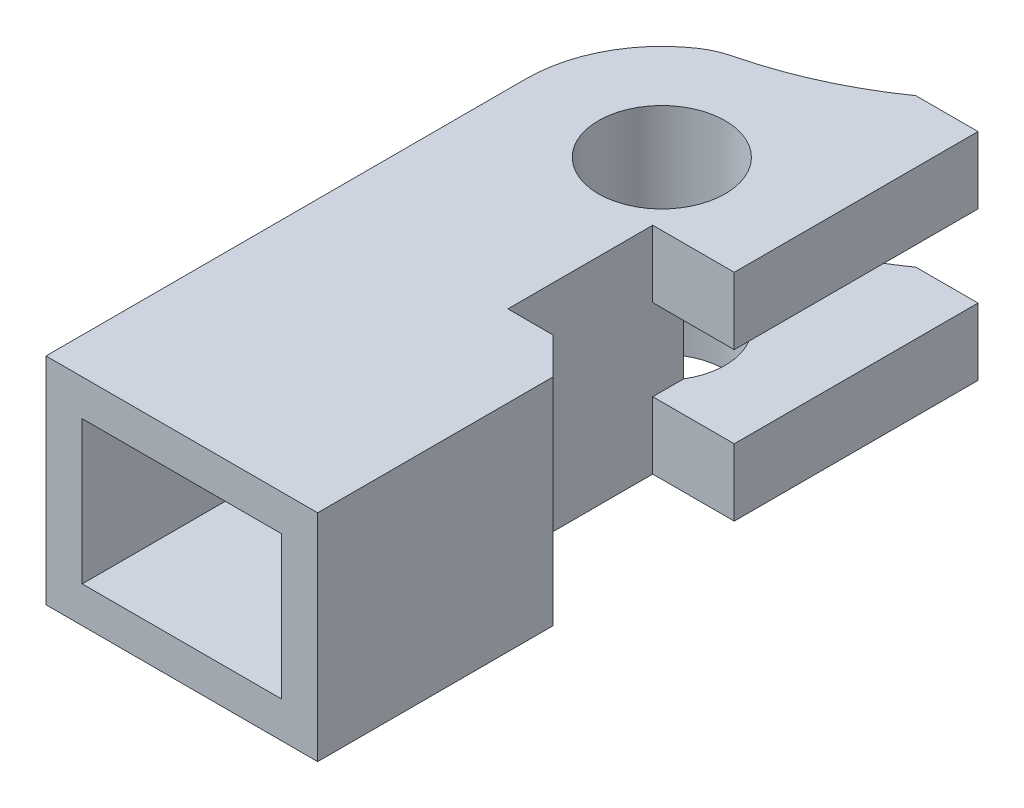
ISO-10303-21;
HEADER;
FILE_DESCRIPTION(('STEP AP214'),'2;1');
FILE_NAME('part.step','',(''),(''),'','','');
FILE_SCHEMA(('AUTOMOTIVE_DESIGN { 1 0 10303 214 1 1 1 1 }'));
ENDSEC;
DATA;
#1=APPLICATION_CONTEXT('core data for automotive mechanical design processes');
#2=APPLICATION_PROTOCOL_DEFINITION('international standard','automotive_design',2000,#1);
#3=PRODUCT_CONTEXT('',#1,'mechanical');
#4=PRODUCT('Part','Part','',(#3));
#5=PRODUCT_RELATED_PRODUCT_CATEGORY('part','',(#4));
#6=PRODUCT_DEFINITION_FORMATION('','',#4);
#7=PRODUCT_DEFINITION_CONTEXT('part definition',#1,'design');
#8=PRODUCT_DEFINITION('design','',#6,#7);
#9=PRODUCT_DEFINITION_SHAPE('','',#8);
#10=(LENGTH_UNIT() NAMED_UNIT(*) SI_UNIT(.MILLI.,.METRE.));
#11=(NAMED_UNIT(*) PLANE_ANGLE_UNIT() SI_UNIT($,.RADIAN.));
#12=(NAMED_UNIT(*) SI_UNIT($,.STERADIAN.) SOLID_ANGLE_UNIT());
#13=UNCERTAINTY_MEASURE_WITH_UNIT(LENGTH_MEASURE(1.E-05),#10,'distance_accuracy_value','');
#14=(GEOMETRIC_REPRESENTATION_CONTEXT(3) GLOBAL_UNCERTAINTY_ASSIGNED_CONTEXT((#13)) GLOBAL_UNIT_ASSIGNED_CONTEXT((#10,
#11,#12)) REPRESENTATION_CONTEXT('',''));
#15=CARTESIAN_POINT('',(0.,0.,0.));
#16=DIRECTION('',(0.,0.,1.));
#17=DIRECTION('',(1.,0.,0.));
#18=AXIS2_PLACEMENT_3D('',#15,#16,#17);
#19=CARTESIAN_POINT('',(-7.49999999999999,0.,-9.95747988102717));
#20=DIRECTION('',(0.,0.,1.));
#21=DIRECTION('',(1.,0.,0.));
#22=AXIS2_PLACEMENT_3D('',#19,#20,#21);
#23=PLANE('',#22);
#24=DIRECTION('',(1.,0.,0.));
#25=VECTOR('',#24,1.);
#26=CARTESIAN_POINT('',(-7.49999999999999,0.,-9.95747988102717));
#27=LINE('',#26,#25);
#28=CARTESIAN_POINT('',(4.06718911135448,0.,-9.95747988102718));
#29=VERTEX_POINT('',#28);
#30=CARTESIAN_POINT('',(7.50000000000013,0.,-9.95747988102717));
#31=VERTEX_POINT('',#30);
#32=EDGE_CURVE('E518',#29,#31,#27,.T.);
#33=ORIENTED_EDGE('',*,*,#32,.F.);
#34=DIRECTION('',(0.,1.,0.));
#35=VECTOR('',#34,1.);
#36=CARTESIAN_POINT('',(4.06718911135448,0.,-9.95747988102717));
#37=LINE('',#36,#35);
#38=CARTESIAN_POINT('',(4.06718911135448,3.7,-9.95747988102717));
#39=VERTEX_POINT('',#38);
#40=EDGE_CURVE('E228',#29,#39,#37,.T.);
#41=ORIENTED_EDGE('',*,*,#40,.T.);
#42=DIRECTION('',(-1.,0.,0.));
#43=VECTOR('',#42,1.);
#44=CARTESIAN_POINT('',(12.0000000000001,3.7,-9.95747988102717));
#45=LINE('',#44,#43);
#46=CARTESIAN_POINT('',(7.50000000000013,3.7,-9.95747988102717));
#47=VERTEX_POINT('',#46);
#48=EDGE_CURVE('E517',#47,#39,#45,.T.);
#49=ORIENTED_EDGE('',*,*,#48,.F.);
#50=DIRECTION('',(0.,1.,0.));
#51=VECTOR('',#50,1.);
#52=CARTESIAN_POINT('',(7.50000000000013,11.9,-9.95747988102717));
#53=LINE('',#52,#51);
#54=EDGE_CURVE('E522',#31,#47,#53,.T.);
#55=ORIENTED_EDGE('',*,*,#54,.F.);
#56=EDGE_LOOP('',(#33,#41,#49,#55));
#57=FACE_BOUND('',#56,.T.);
#58=ADVANCED_FACE('F46',(#57),#23,.F.);
#59=CARTESIAN_POINT('',(7.50000000000013,11.9,3.50088613505739));
#60=DIRECTION('',(0.,0.,-1.));
#61=DIRECTION('',(-1.,0.,0.));
#62=AXIS2_PLACEMENT_3D('',#59,#60,#61);
#63=PLANE('',#62);
#64=DIRECTION('',(0.,-1.,0.));
#65=VECTOR('',#64,1.);
#66=CARTESIAN_POINT('',(7.50000000000013,11.9,3.50088613505739));
#67=LINE('',#66,#65);
#68=CARTESIAN_POINT('',(7.50000000000013,3.7,3.50088613505739));
#69=VERTEX_POINT('',#68);
#70=CARTESIAN_POINT('',(7.50000000000013,0.,3.50088613505739));
#71=VERTEX_POINT('',#70);
#72=EDGE_CURVE('E307',#69,#71,#67,.T.);
#73=ORIENTED_EDGE('',*,*,#72,.F.);
#74=DIRECTION('',(1.,0.,0.));
#75=VECTOR('',#74,1.);
#76=CARTESIAN_POINT('',(12.0000000000001,3.7,3.50088613505739));
#77=LINE('',#76,#75);
#78=CARTESIAN_POINT('',(3.00000000000013,3.7,3.50088613505739));
#79=VERTEX_POINT('',#78);
#80=EDGE_CURVE('E355',#79,#69,#77,.T.);
#81=ORIENTED_EDGE('',*,*,#80,.F.);
#82=DIRECTION('',(0.,-1.,0.));
#83=VECTOR('',#82,1.);
#84=CARTESIAN_POINT('',(3.00000000000013,11.9,3.50088613505739));
#85=LINE('',#84,#83);
#86=CARTESIAN_POINT('',(3.00000000000013,0.,3.50088613505739));
#87=VERTEX_POINT('',#86);
#88=EDGE_CURVE('E306',#79,#87,#85,.T.);
#89=ORIENTED_EDGE('',*,*,#88,.T.);
#90=DIRECTION('',(1.,0.,0.));
#91=VECTOR('',#90,1.);
#92=CARTESIAN_POINT('',(7.50000000000013,0.,3.50088613505739));
#93=LINE('',#92,#91);
#94=EDGE_CURVE('E289',#87,#71,#93,.T.);
#95=ORIENTED_EDGE('',*,*,#94,.T.);
#96=EDGE_LOOP('',(#73,#81,#89,#95));
#97=FACE_BOUND('',#96,.T.);
#98=ADVANCED_FACE('F455',(#97),#63,.F.);
#99=CARTESIAN_POINT('',(7.50000000000013,11.9,1.35308431126191E-13));
#100=DIRECTION('',(-1.,0.,0.));
#101=DIRECTION('',(0.,0.,1.));
#102=AXIS2_PLACEMENT_3D('',#99,#100,#101);
#103=PLANE('',#102);
#104=DIRECTION('',(0.,0.,-1.));
#105=VECTOR('',#104,1.);
#106=CARTESIAN_POINT('',(7.50000000000013,0.,1.35308431126191E-13));
#107=LINE('',#106,#105);
#108=EDGE_CURVE('E297',#71,#31,#107,.T.);
#109=ORIENTED_EDGE('',*,*,#108,.T.);
#110=ORIENTED_EDGE('',*,*,#54,.T.);
#111=DIRECTION('',(0.,0.,1.));
#112=VECTOR('',#111,1.);
#113=CARTESIAN_POINT('',(7.50000000000013,3.7,1.35308431126191E-13));
#114=LINE('',#113,#112);
#115=EDGE_CURVE('E368',#47,#69,#114,.T.);
#116=ORIENTED_EDGE('',*,*,#115,.T.);
#117=ORIENTED_EDGE('',*,*,#72,.T.);
#118=EDGE_LOOP('',(#109,#110,#116,#117));
#119=FACE_BOUND('',#118,.T.);
#120=ADVANCED_FACE('F463',(#119),#103,.F.);
#121=CARTESIAN_POINT('',(4.81608162486087,11.9,-5.65747988102717));
#122=DIRECTION('',(0.,1.,0.));
#123=DIRECTION('',(0.,0.,1.));
#124=AXIS2_PLACEMENT_3D('',#121,#122,#123);
#125=PLANE('',#124);
#126=DIRECTION('',(0.,0.,-1.));
#127=VECTOR('',#126,1.);
#128=CARTESIAN_POINT('',(7.50000000000013,11.9,11.5008861350574));
#129=LINE('',#128,#127);
#130=CARTESIAN_POINT('',(7.50000000000013,11.9,26.5008861350574));
#131=VERTEX_POINT('',#130);
#132=CARTESIAN_POINT('',(7.50000000000013,11.9,13.5008861350574));
#133=VERTEX_POINT('',#132);
#134=EDGE_CURVE('E383',#131,#133,#129,.T.);
#135=ORIENTED_EDGE('',*,*,#134,.T.);
#136=DIRECTION('',(0.707106781186546,0.,0.707106781186549));
#137=VECTOR('',#136,1.);
#138=CARTESIAN_POINT('',(-3.42114219561179,11.9,2.57974393944545));
#139=LINE('',#138,#137);
#140=CARTESIAN_POINT('',(5.50000000000013,11.9,11.5008861350574));
#141=VERTEX_POINT('',#140);
#142=EDGE_CURVE('E11',#133,#141,#139,.F.);
#143=ORIENTED_EDGE('',*,*,#142,.T.);
#144=DIRECTION('',(-1.,0.,0.));
#145=VECTOR('',#144,1.);
#146=CARTESIAN_POINT('',(3.00000000000013,11.9,11.5008861350574));
#147=LINE('',#146,#145);
#148=CARTESIAN_POINT('',(3.00000000000013,11.9,11.5008861350574));
#149=VERTEX_POINT('',#148);
#150=EDGE_CURVE('E275',#141,#149,#147,.T.);
#151=ORIENTED_EDGE('',*,*,#150,.T.);
#152=DIRECTION('',(0.,0.,-1.));
#153=VECTOR('',#152,1.);
#154=CARTESIAN_POINT('',(3.00000000000013,11.9,3.50088613505739));
#155=LINE('',#154,#153);
#156=CARTESIAN_POINT('',(3.00000000000013,11.9,3.50088613505739));
#157=VERTEX_POINT('',#156);
#158=EDGE_CURVE('E388',#149,#157,#155,.T.);
#159=ORIENTED_EDGE('',*,*,#158,.T.);
#160=DIRECTION('',(1.,0.,0.));
#161=VECTOR('',#160,1.);
#162=CARTESIAN_POINT('',(7.50000000000013,11.9,3.50088613505739));
#163=LINE('',#162,#161);
#164=CARTESIAN_POINT('',(7.50000000000013,11.9,3.50088613505739));
#165=VERTEX_POINT('',#164);
#166=EDGE_CURVE('E391',#157,#165,#163,.T.);
#167=ORIENTED_EDGE('',*,*,#166,.T.);
#168=DIRECTION('',(0.,0.,-1.));
#169=VECTOR('',#168,1.);
#170=CARTESIAN_POINT('',(7.50000000000013,11.9,1.35308431126191E-13));
#171=LINE('',#170,#169);
#172=CARTESIAN_POINT('',(7.50000000000013,11.9,-9.95747988102717));
#173=VERTEX_POINT('',#172);
#174=EDGE_CURVE('E394',#165,#173,#171,.T.);
#175=ORIENTED_EDGE('',*,*,#174,.T.);
#176=DIRECTION('',(1.,0.,0.));
#177=VECTOR('',#176,1.);
#178=CARTESIAN_POINT('',(-7.49999999999999,11.9,-9.95747988102717));
#179=LINE('',#178,#177);
#180=CARTESIAN_POINT('',(4.06718911135448,11.9,-9.95747988102717));
#181=VERTEX_POINT('',#180);
#182=EDGE_CURVE('E248',#181,#173,#179,.T.);
#183=ORIENTED_EDGE('',*,*,#182,.F.);
#184=CARTESIAN_POINT('',(-7.86844131425465,11.9,-26.9394678796001));
#185=DIRECTION('',(0.,-1.,0.));
#186=DIRECTION('',(0.,0.,1.));
#187=AXIS2_PLACEMENT_3D('',#184,#185,#186);
#188=CIRCLE('',#187,20.7568588673817);
#189=CARTESIAN_POINT('',(-2.91799523600944,11.9,-6.78158421918604));
#190=VERTEX_POINT('',#189);
#191=EDGE_CURVE('E207',#181,#190,#188,.T.);
#192=ORIENTED_EDGE('',*,*,#191,.T.);
#193=CARTESIAN_POINT('',(-1.96400771605293,11.9,-2.89701116519836));
#194=DIRECTION('',(0.,1.,0.));
#195=DIRECTION('',(0.,0.,1.));
#196=AXIS2_PLACEMENT_3D('',#193,#194,#195);
#197=CIRCLE('',#196,4.);
#198=CARTESIAN_POINT('',(-4.2085879629706,11.9,-6.20788106828229));
#199=VERTEX_POINT('',#198);
#200=EDGE_CURVE('E259',#190,#199,#197,.T.);
#201=ORIENTED_EDGE('',*,*,#200,.T.);
#202=CARTESIAN_POINT('',(0.,11.9,1.35308431126191E-13));
#203=DIRECTION('',(0.,1.,0.));
#204=DIRECTION('',(0.,0.,1.));
#205=AXIS2_PLACEMENT_3D('',#202,#203,#204);
#206=CIRCLE('',#205,7.50000000000006);
#207=CARTESIAN_POINT('',(-7.49999999999999,11.9,1.35308431126191E-13));
#208=VERTEX_POINT('',#207);
#209=EDGE_CURVE('E301',#199,#208,#206,.T.);
#210=ORIENTED_EDGE('',*,*,#209,.T.);
#211=DIRECTION('',(0.,0.,1.));
#212=VECTOR('',#211,1.);
#213=CARTESIAN_POINT('',(-7.49999999999999,11.9,16.5008861350574));
#214=LINE('',#213,#212);
#215=CARTESIAN_POINT('',(-7.49999999999999,11.9,26.5008861350574));
#216=VERTEX_POINT('',#215);
#217=EDGE_CURVE('E380',#208,#216,#214,.T.);
#218=ORIENTED_EDGE('',*,*,#217,.T.);
#219=DIRECTION('',(-1.,0.,0.));
#220=VECTOR('',#219,1.);
#221=CARTESIAN_POINT('',(7.50000000000013,11.9,26.5008861350574));
#222=LINE('',#221,#220);
#223=EDGE_CURVE('E420',#131,#216,#222,.T.);
#224=ORIENTED_EDGE('',*,*,#223,.F.);
#225=EDGE_LOOP('',(#135,#143,#151,#159,#167,#175,#183,#192,#201,#210,#218,#224));
#226=FACE_BOUND('',#225,.T.);
#227=CARTESIAN_POINT('',(0.,11.9,1.35308431126191E-13));
#228=DIRECTION('',(0.,1.,0.));
#229=DIRECTION('',(0.,0.,1.));
#230=AXIS2_PLACEMENT_3D('',#227,#228,#229);
#231=CIRCLE('',#230,3.50000000000018);
#232=CARTESIAN_POINT('',(0.,11.9,3.50000000000032));
#233=VERTEX_POINT('',#232);
#234=EDGE_CURVE('E244',#233,#233,#231,.T.);
#235=ORIENTED_EDGE('',*,*,#234,.F.);
#236=EDGE_LOOP('',(#235));
#237=FACE_BOUND('',#236,.T.);
#238=ADVANCED_FACE('F434',(#226,#237),#125,.T.);
#239=CARTESIAN_POINT('',(4.81608162486087,0.,-5.65747988102717));
#240=DIRECTION('',(0.,1.,0.));
#241=DIRECTION('',(0.,0.,1.));
#242=AXIS2_PLACEMENT_3D('',#239,#240,#241);
#243=PLANE('',#242);
#244=DIRECTION('',(-1.,0.,0.));
#245=VECTOR('',#244,1.);
#246=CARTESIAN_POINT('',(3.00000000000013,0.,11.5008861350574));
#247=LINE('',#246,#245);
#248=CARTESIAN_POINT('',(5.50000000000013,0.,11.5008861350574));
#249=VERTEX_POINT('',#248);
#250=CARTESIAN_POINT('',(3.00000000000013,0.,11.5008861350574));
#251=VERTEX_POINT('',#250);
#252=EDGE_CURVE('E273',#249,#251,#247,.T.);
#253=ORIENTED_EDGE('',*,*,#252,.F.);
#254=DIRECTION('',(-0.707106781186546,0.,-0.707106781186549));
#255=VECTOR('',#254,1.);
#256=CARTESIAN_POINT('',(5.50000000000013,0.,11.5008861350574));
#257=LINE('',#256,#255);
#258=CARTESIAN_POINT('',(7.50000000000013,0.,13.5008861350574));
#259=VERTEX_POINT('',#258);
#260=EDGE_CURVE('E70',#249,#259,#257,.F.);
#261=ORIENTED_EDGE('',*,*,#260,.T.);
#262=DIRECTION('',(0.,0.,-1.));
#263=VECTOR('',#262,1.);
#264=CARTESIAN_POINT('',(7.50000000000013,0.,11.5008861350574));
#265=LINE('',#264,#263);
#266=CARTESIAN_POINT('',(7.50000000000013,0.,26.5008861350574));
#267=VERTEX_POINT('',#266);
#268=EDGE_CURVE('E285',#267,#259,#265,.T.);
#269=ORIENTED_EDGE('',*,*,#268,.F.);
#270=DIRECTION('',(1.,0.,0.));
#271=VECTOR('',#270,1.);
#272=CARTESIAN_POINT('',(-7.49999999999999,0.,26.5008861350574));
#273=LINE('',#272,#271);
#274=CARTESIAN_POINT('',(-7.49999999999999,0.,26.5008861350574));
#275=VERTEX_POINT('',#274);
#276=EDGE_CURVE('E409',#275,#267,#273,.T.);
#277=ORIENTED_EDGE('',*,*,#276,.F.);
#278=DIRECTION('',(0.,0.,1.));
#279=VECTOR('',#278,1.);
#280=CARTESIAN_POINT('',(-7.49999999999999,0.,16.5008861350574));
#281=LINE('',#280,#279);
#282=CARTESIAN_POINT('',(-7.49999999999999,0.,1.35308431126191E-13));
#283=VERTEX_POINT('',#282);
#284=EDGE_CURVE('E243',#283,#275,#281,.T.);
#285=ORIENTED_EDGE('',*,*,#284,.F.);
#286=CARTESIAN_POINT('',(0.,0.,1.35308431126191E-13));
#287=DIRECTION('',(0.,1.,0.));
#288=DIRECTION('',(0.,0.,1.));
#289=AXIS2_PLACEMENT_3D('',#286,#287,#288);
#290=CIRCLE('',#289,7.50000000000006);
#291=CARTESIAN_POINT('',(-4.2085879629706,0.,-6.20788106828229));
#292=VERTEX_POINT('',#291);
#293=EDGE_CURVE('E240',#292,#283,#290,.T.);
#294=ORIENTED_EDGE('',*,*,#293,.F.);
#295=CARTESIAN_POINT('',(-1.96400771605293,0.,-2.89701116519836));
#296=DIRECTION('',(0.,1.,0.));
#297=DIRECTION('',(0.,0.,1.));
#298=AXIS2_PLACEMENT_3D('',#295,#296,#297);
#299=CIRCLE('',#298,4.);
#300=CARTESIAN_POINT('',(-2.91799523600944,0.,-6.78158421918604));
#301=VERTEX_POINT('',#300);
#302=EDGE_CURVE('E253',#292,#301,#299,.F.);
#303=ORIENTED_EDGE('',*,*,#302,.T.);
#304=CARTESIAN_POINT('',(-7.86844131425465,0.,-26.9394678796001));
#305=DIRECTION('',(0.,-1.,0.));
#306=DIRECTION('',(0.,0.,-1.));
#307=AXIS2_PLACEMENT_3D('',#304,#305,#306);
#308=CIRCLE('',#307,20.7568588673817);
#309=EDGE_CURVE('E245',#29,#301,#308,.T.);
#310=ORIENTED_EDGE('',*,*,#309,.F.);
#311=ORIENTED_EDGE('',*,*,#32,.T.);
#312=ORIENTED_EDGE('',*,*,#108,.F.);
#313=ORIENTED_EDGE('',*,*,#94,.F.);
#314=DIRECTION('',(0.,0.,-1.));
#315=VECTOR('',#314,1.);
#316=CARTESIAN_POINT('',(3.00000000000013,0.,3.50088613505739));
#317=LINE('',#316,#315);
#318=EDGE_CURVE('E283',#251,#87,#317,.T.);
#319=ORIENTED_EDGE('',*,*,#318,.F.);
#320=EDGE_LOOP('',(#253,#261,#269,#277,#285,#294,#303,#310,#311,#312,#313,#319));
#321=FACE_BOUND('',#320,.T.);
#322=CARTESIAN_POINT('',(0.,0.,1.35308431126191E-13));
#323=DIRECTION('',(0.,1.,0.));
#324=DIRECTION('',(0.,0.,1.));
#325=AXIS2_PLACEMENT_3D('',#322,#323,#324);
#326=CIRCLE('',#325,3.50000000000018);
#327=CARTESIAN_POINT('',(0.,0.,3.50000000000032));
#328=VERTEX_POINT('',#327);
#329=EDGE_CURVE('E371',#328,#328,#326,.T.);
#330=ORIENTED_EDGE('',*,*,#329,.T.);
#331=EDGE_LOOP('',(#330));
#332=FACE_BOUND('',#331,.T.);
#333=ADVANCED_FACE('F279',(#321,#332),#243,.F.);
#334=CARTESIAN_POINT('',(0.,11.9,1.35308431126191E-13));
#335=DIRECTION('',(0.,-1.,0.));
#336=DIRECTION('',(0.,0.,-1.));
#337=AXIS2_PLACEMENT_3D('',#334,#335,#336);
#338=CYLINDRICAL_SURFACE('',#337,7.50000000000006);
#339=ORIENTED_EDGE('',*,*,#209,.F.);
#340=DIRECTION('',(0.,-1.,0.));
#341=VECTOR('',#340,1.);
#342=CARTESIAN_POINT('',(-4.2085879629706,11.9,-6.20788106828229));
#343=LINE('',#342,#341);
#344=EDGE_CURVE('E234',#199,#292,#343,.T.);
#345=ORIENTED_EDGE('',*,*,#344,.T.);
#346=ORIENTED_EDGE('',*,*,#293,.T.);
#347=DIRECTION('',(0.,-1.,0.));
#348=VECTOR('',#347,1.);
#349=CARTESIAN_POINT('',(-7.49999999999999,11.9,1.35308431126191E-13));
#350=LINE('',#349,#348);
#351=EDGE_CURVE('E315',#208,#283,#350,.T.);
#352=ORIENTED_EDGE('',*,*,#351,.F.);
#353=EDGE_LOOP('',(#339,#345,#346,#352));
#354=FACE_BOUND('',#353,.T.);
#355=ADVANCED_FACE('F440',(#354),#338,.T.);
#356=CARTESIAN_POINT('',(-7.49999999999999,11.9,16.5008861350574));
#357=DIRECTION('',(1.,0.,0.));
#358=DIRECTION('',(0.,0.,-1.));
#359=AXIS2_PLACEMENT_3D('',#356,#357,#358);
#360=PLANE('',#359);
#361=ORIENTED_EDGE('',*,*,#284,.T.);
#362=DIRECTION('',(0.,-1.,0.));
#363=VECTOR('',#362,1.);
#364=CARTESIAN_POINT('',(-7.49999999999999,11.9,26.5008861350574));
#365=LINE('',#364,#363);
#366=EDGE_CURVE('E405',#216,#275,#365,.T.);
#367=ORIENTED_EDGE('',*,*,#366,.F.);
#368=ORIENTED_EDGE('',*,*,#217,.F.);
#369=ORIENTED_EDGE('',*,*,#351,.T.);
#370=EDGE_LOOP('',(#361,#367,#368,#369));
#371=FACE_BOUND('',#370,.T.);
#372=ADVANCED_FACE('F402',(#371),#360,.F.);
#373=CARTESIAN_POINT('',(7.50000000000013,11.9,11.5008861350574));
#374=DIRECTION('',(-1.,0.,0.));
#375=DIRECTION('',(0.,0.,1.));
#376=AXIS2_PLACEMENT_3D('',#373,#374,#375);
#377=PLANE('',#376);
#378=ORIENTED_EDGE('',*,*,#268,.T.);
#379=DIRECTION('',(0.,1.,0.));
#380=VECTOR('',#379,1.);
#381=CARTESIAN_POINT('',(7.50000000000013,11.9,13.5008861350574));
#382=LINE('',#381,#380);
#383=EDGE_CURVE('E56',#259,#133,#382,.T.);
#384=ORIENTED_EDGE('',*,*,#383,.T.);
#385=ORIENTED_EDGE('',*,*,#134,.F.);
#386=DIRECTION('',(0.,1.,0.));
#387=VECTOR('',#386,1.);
#388=CARTESIAN_POINT('',(7.50000000000013,0.,26.5008861350574));
#389=LINE('',#388,#387);
#390=EDGE_CURVE('E414',#267,#131,#389,.T.);
#391=ORIENTED_EDGE('',*,*,#390,.F.);
#392=EDGE_LOOP('',(#378,#384,#385,#391));
#393=FACE_BOUND('',#392,.T.);
#394=ADVANCED_FACE('F487',(#393),#377,.F.);
#395=CARTESIAN_POINT('',(3.00000000000013,11.9,11.5008861350574));
#396=DIRECTION('',(0.,0.,1.));
#397=DIRECTION('',(1.,0.,0.));
#398=AXIS2_PLACEMENT_3D('',#395,#396,#397);
#399=PLANE('',#398);
#400=ORIENTED_EDGE('',*,*,#150,.F.);
#401=DIRECTION('',(0.,-1.,0.));
#402=VECTOR('',#401,1.);
#403=CARTESIAN_POINT('',(5.50000000000013,11.9,11.5008861350574));
#404=LINE('',#403,#402);
#405=EDGE_CURVE('E262',#141,#249,#404,.T.);
#406=ORIENTED_EDGE('',*,*,#405,.T.);
#407=ORIENTED_EDGE('',*,*,#252,.T.);
#408=DIRECTION('',(0.,-1.,0.));
#409=VECTOR('',#408,1.);
#410=CARTESIAN_POINT('',(3.00000000000013,11.9,11.5008861350574));
#411=LINE('',#410,#409);
#412=EDGE_CURVE('E312',#149,#251,#411,.T.);
#413=ORIENTED_EDGE('',*,*,#412,.F.);
#414=EDGE_LOOP('',(#400,#406,#407,#413));
#415=FACE_BOUND('',#414,.T.);
#416=ADVANCED_FACE('F271',(#415),#399,.F.);
#417=CARTESIAN_POINT('',(3.00000000000013,11.9,3.50088613505739));
#418=DIRECTION('',(-1.,0.,0.));
#419=DIRECTION('',(0.,0.,1.));
#420=AXIS2_PLACEMENT_3D('',#417,#418,#419);
#421=PLANE('',#420);
#422=ORIENTED_EDGE('',*,*,#318,.T.);
#423=ORIENTED_EDGE('',*,*,#88,.F.);
#424=DIRECTION('',(0.,0.,-1.));
#425=VECTOR('',#424,1.);
#426=CARTESIAN_POINT('',(3.00000000000013,3.7,13.5631920338064));
#427=LINE('',#426,#425);
#428=CARTESIAN_POINT('',(3.00000000000013,3.7,1.80277563773238));
#429=VERTEX_POINT('',#428);
#430=EDGE_CURVE('E341',#79,#429,#427,.T.);
#431=ORIENTED_EDGE('',*,*,#430,.T.);
#432=DIRECTION('',(0.,-1.,0.));
#433=VECTOR('',#432,1.);
#434=CARTESIAN_POINT('',(3.00000000000013,11.9,1.80277563773238));
#435=LINE('',#434,#433);
#436=CARTESIAN_POINT('',(3.00000000000013,8.2,1.80277563773238));
#437=VERTEX_POINT('',#436);
#438=EDGE_CURVE('E322',#429,#437,#435,.F.);
#439=ORIENTED_EDGE('',*,*,#438,.T.);
#440=DIRECTION('',(0.,0.,-1.));
#441=VECTOR('',#440,1.);
#442=CARTESIAN_POINT('',(3.00000000000013,8.2,13.5631920338064));
#443=LINE('',#442,#441);
#444=CARTESIAN_POINT('',(3.00000000000013,8.2,3.50088613505739));
#445=VERTEX_POINT('',#444);
#446=EDGE_CURVE('E342',#445,#437,#443,.T.);
#447=ORIENTED_EDGE('',*,*,#446,.F.);
#448=EDGE_CURVE('E308',#157,#445,#85,.T.);
#449=ORIENTED_EDGE('',*,*,#448,.F.);
#450=ORIENTED_EDGE('',*,*,#158,.F.);
#451=ORIENTED_EDGE('',*,*,#412,.T.);
#452=EDGE_LOOP('',(#422,#423,#431,#439,#447,#449,#450,#451));
#453=FACE_BOUND('',#452,.T.);
#454=ADVANCED_FACE('F349',(#453),#421,.F.);
#455=ORIENTED_EDGE('',*,*,#448,.T.);
#456=DIRECTION('',(-1.,0.,0.));
#457=VECTOR('',#456,1.);
#458=CARTESIAN_POINT('',(12.0000000000001,8.2,3.50088613505739));
#459=LINE('',#458,#457);
#460=CARTESIAN_POINT('',(7.50000000000013,8.2,3.50088613505739));
#461=VERTEX_POINT('',#460);
#462=EDGE_CURVE('E357',#461,#445,#459,.T.);
#463=ORIENTED_EDGE('',*,*,#462,.F.);
#464=EDGE_CURVE('E302',#165,#461,#67,.T.);
#465=ORIENTED_EDGE('',*,*,#464,.F.);
#466=ORIENTED_EDGE('',*,*,#166,.F.);
#467=EDGE_LOOP('',(#455,#463,#465,#466));
#468=FACE_BOUND('',#467,.T.);
#469=ADVANCED_FACE('F466',(#468),#63,.F.);
#470=DIRECTION('',(0.,0.,-1.));
#471=VECTOR('',#470,1.);
#472=CARTESIAN_POINT('',(7.50000000000013,8.2,1.35308431126191E-13));
#473=LINE('',#472,#471);
#474=CARTESIAN_POINT('',(7.50000000000013,8.2,-9.95747988102717));
#475=VERTEX_POINT('',#474);
#476=EDGE_CURVE('E365',#461,#475,#473,.T.);
#477=ORIENTED_EDGE('',*,*,#476,.T.);
#478=DIRECTION('',(0.,1.,0.));
#479=VECTOR('',#478,1.);
#480=CARTESIAN_POINT('',(7.50000000000013,11.9,-9.95747988102717));
#481=LINE('',#480,#479);
#482=EDGE_CURVE('E225',#475,#173,#481,.T.);
#483=ORIENTED_EDGE('',*,*,#482,.T.);
#484=ORIENTED_EDGE('',*,*,#174,.F.);
#485=ORIENTED_EDGE('',*,*,#464,.T.);
#486=EDGE_LOOP('',(#477,#483,#484,#485));
#487=FACE_BOUND('',#486,.T.);
#488=ADVANCED_FACE('F500',(#487),#103,.F.);
#489=CARTESIAN_POINT('',(0.,11.9,1.35308431126191E-13));
#490=DIRECTION('',(0.,-1.,0.));
#491=DIRECTION('',(0.,0.,-1.));
#492=AXIS2_PLACEMENT_3D('',#489,#490,#491);
#493=CYLINDRICAL_SURFACE('',#492,3.50000000000018);
#494=CARTESIAN_POINT('',(0.,3.7,1.35308431126191E-13));
#495=DIRECTION('',(0.,-1.,0.));
#496=DIRECTION('',(0.,0.,-1.));
#497=AXIS2_PLACEMENT_3D('',#494,#495,#496);
#498=CIRCLE('',#497,3.50000000000018);
#499=CARTESIAN_POINT('',(3.00000000000013,3.7,-1.80277563773211));
#500=VERTEX_POINT('',#499);
#501=EDGE_CURVE('E229',#500,#429,#498,.T.);
#502=ORIENTED_EDGE('',*,*,#501,.F.);
#503=DIRECTION('',(0.,-1.,0.));
#504=VECTOR('',#503,1.);
#505=CARTESIAN_POINT('',(3.00000000000013,11.9,-1.80277563773211));
#506=LINE('',#505,#504);
#507=CARTESIAN_POINT('',(3.00000000000013,8.2,-1.80277563773211));
#508=VERTEX_POINT('',#507);
#509=EDGE_CURVE('E236',#508,#500,#506,.T.);
#510=ORIENTED_EDGE('',*,*,#509,.F.);
#511=CARTESIAN_POINT('',(0.,8.2,1.35308431126191E-13));
#512=DIRECTION('',(0.,1.,0.));
#513=DIRECTION('',(0.,0.,1.));
#514=AXIS2_PLACEMENT_3D('',#511,#512,#513);
#515=CIRCLE('',#514,3.50000000000018);
#516=EDGE_CURVE('E319',#437,#508,#515,.T.);
#517=ORIENTED_EDGE('',*,*,#516,.F.);
#518=ORIENTED_EDGE('',*,*,#438,.F.);
#519=EDGE_LOOP('',(#502,#510,#517,#518));
#520=FACE_BOUND('',#519,.T.);
#521=ORIENTED_EDGE('',*,*,#234,.T.);
#522=EDGE_LOOP('',(#521));
#523=FACE_BOUND('',#522,.T.);
#524=ORIENTED_EDGE('',*,*,#329,.F.);
#525=EDGE_LOOP('',(#524));
#526=FACE_BOUND('',#525,.T.);
#527=ADVANCED_FACE('F345',(#520,#523,#526),#493,.F.);
#528=CARTESIAN_POINT('',(3.00000000000013,3.7,13.5631920338064));
#529=DIRECTION('',(-1.,0.,0.));
#530=DIRECTION('',(0.,0.,1.));
#531=AXIS2_PLACEMENT_3D('',#528,#529,#530);
#532=PLANE('',#531);
#533=CARTESIAN_POINT('',(3.00000000000013,3.7,-9.25545890428567));
#534=VERTEX_POINT('',#533);
#535=EDGE_CURVE('E331',#500,#534,#427,.T.);
#536=ORIENTED_EDGE('',*,*,#535,.T.);
#537=DIRECTION('',(0.,-1.,0.));
#538=VECTOR('',#537,1.);
#539=CARTESIAN_POINT('',(3.00000000000013,11.9,-9.25545890428567));
#540=LINE('',#539,#538);
#541=CARTESIAN_POINT('',(3.00000000000013,8.2,-9.25545890428567));
#542=VERTEX_POINT('',#541);
#543=EDGE_CURVE('E221',#534,#542,#540,.F.);
#544=ORIENTED_EDGE('',*,*,#543,.T.);
#545=EDGE_CURVE('E219',#508,#542,#443,.T.);
#546=ORIENTED_EDGE('',*,*,#545,.F.);
#547=ORIENTED_EDGE('',*,*,#509,.T.);
#548=EDGE_LOOP('',(#536,#544,#546,#547));
#549=FACE_BOUND('',#548,.T.);
#550=ADVANCED_FACE('F330',(#549),#532,.F.);
#551=CARTESIAN_POINT('',(12.0000000000001,3.7,13.5631920338064));
#552=DIRECTION('',(0.,-1.,0.));
#553=DIRECTION('',(0.,0.,-1.));
#554=AXIS2_PLACEMENT_3D('',#551,#552,#553);
#555=PLANE('',#554);
#556=ORIENTED_EDGE('',*,*,#48,.T.);
#557=CARTESIAN_POINT('',(-7.86844131425465,3.7,-26.9394678796001));
#558=DIRECTION('',(0.,-1.,0.));
#559=DIRECTION('',(0.,0.,-1.));
#560=AXIS2_PLACEMENT_3D('',#557,#558,#559);
#561=CIRCLE('',#560,20.7568588673817);
#562=EDGE_CURVE('E249',#39,#534,#561,.T.);
#563=ORIENTED_EDGE('',*,*,#562,.T.);
#564=ORIENTED_EDGE('',*,*,#535,.F.);
#565=ORIENTED_EDGE('',*,*,#501,.T.);
#566=ORIENTED_EDGE('',*,*,#430,.F.);
#567=ORIENTED_EDGE('',*,*,#80,.T.);
#568=ORIENTED_EDGE('',*,*,#115,.F.);
#569=EDGE_LOOP('',(#556,#563,#564,#565,#566,#567,#568));
#570=FACE_BOUND('',#569,.T.);
#571=ADVANCED_FACE('F338',(#570),#555,.F.);
#572=CARTESIAN_POINT('',(12.0000000000001,8.2,13.5631920338064));
#573=DIRECTION('',(0.,1.,0.));
#574=DIRECTION('',(0.,0.,1.));
#575=AXIS2_PLACEMENT_3D('',#572,#573,#574);
#576=PLANE('',#575);
#577=ORIENTED_EDGE('',*,*,#545,.T.);
#578=CARTESIAN_POINT('',(-7.86844131425465,8.2,-26.9394678796001));
#579=DIRECTION('',(0.,1.,0.));
#580=DIRECTION('',(0.,0.,1.));
#581=AXIS2_PLACEMENT_3D('',#578,#579,#580);
#582=CIRCLE('',#581,20.7568588673817);
#583=CARTESIAN_POINT('',(4.06718911135448,8.2,-9.95747988102717));
#584=VERTEX_POINT('',#583);
#585=EDGE_CURVE('E204',#542,#584,#582,.T.);
#586=ORIENTED_EDGE('',*,*,#585,.T.);
#587=DIRECTION('',(1.,0.,0.));
#588=VECTOR('',#587,1.);
#589=CARTESIAN_POINT('',(12.0000000000001,8.2,-9.95747988102717));
#590=LINE('',#589,#588);
#591=EDGE_CURVE('E216',#584,#475,#590,.T.);
#592=ORIENTED_EDGE('',*,*,#591,.T.);
#593=ORIENTED_EDGE('',*,*,#476,.F.);
#594=ORIENTED_EDGE('',*,*,#462,.T.);
#595=ORIENTED_EDGE('',*,*,#446,.T.);
#596=ORIENTED_EDGE('',*,*,#516,.T.);
#597=EDGE_LOOP('',(#577,#586,#592,#593,#594,#595,#596));
#598=FACE_BOUND('',#597,.T.);
#599=ADVANCED_FACE('F215',(#598),#576,.F.);
#600=CARTESIAN_POINT('',(0.,0.,26.5008861350574));
#601=DIRECTION('',(0.,0.,1.));
#602=DIRECTION('',(1.,0.,0.));
#603=AXIS2_PLACEMENT_3D('',#600,#601,#602);
#604=PLANE('',#603);
#605=ORIENTED_EDGE('',*,*,#366,.T.);
#606=ORIENTED_EDGE('',*,*,#276,.T.);
#607=ORIENTED_EDGE('',*,*,#390,.T.);
#608=ORIENTED_EDGE('',*,*,#223,.T.);
#609=EDGE_LOOP('',(#605,#606,#607,#608));
#610=FACE_BOUND('',#609,.T.);
#611=DIRECTION('',(0.,-1.,0.));
#612=VECTOR('',#611,1.);
#613=CARTESIAN_POINT('',(-5.49999999999999,9.9,26.5008861350574));
#614=LINE('',#613,#612);
#615=CARTESIAN_POINT('',(-5.49999999999999,9.9,26.5008861350574));
#616=VERTEX_POINT('',#615);
#617=CARTESIAN_POINT('',(-5.49999999999999,2.,26.5008861350574));
#618=VERTEX_POINT('',#617);
#619=EDGE_CURVE('E534',#616,#618,#614,.T.);
#620=ORIENTED_EDGE('',*,*,#619,.F.);
#621=DIRECTION('',(-1.,0.,0.));
#622=VECTOR('',#621,1.);
#623=CARTESIAN_POINT('',(5.50000000000013,9.9,26.5008861350574));
#624=LINE('',#623,#622);
#625=CARTESIAN_POINT('',(5.50000000000013,9.9,26.5008861350574));
#626=VERTEX_POINT('',#625);
#627=EDGE_CURVE('E531',#626,#616,#624,.T.);
#628=ORIENTED_EDGE('',*,*,#627,.F.);
#629=DIRECTION('',(0.,1.,0.));
#630=VECTOR('',#629,1.);
#631=CARTESIAN_POINT('',(5.50000000000013,2.,26.5008861350574));
#632=LINE('',#631,#630);
#633=CARTESIAN_POINT('',(5.50000000000013,2.,26.5008861350574));
#634=VERTEX_POINT('',#633);
#635=EDGE_CURVE('E542',#634,#626,#632,.T.);
#636=ORIENTED_EDGE('',*,*,#635,.F.);
#637=DIRECTION('',(1.,0.,0.));
#638=VECTOR('',#637,1.);
#639=CARTESIAN_POINT('',(-5.49999999999999,2.,26.5008861350574));
#640=LINE('',#639,#638);
#641=EDGE_CURVE('E538',#618,#634,#640,.T.);
#642=ORIENTED_EDGE('',*,*,#641,.F.);
#643=EDGE_LOOP('',(#620,#628,#636,#642));
#644=FACE_BOUND('',#643,.T.);
#645=ADVANCED_FACE('F417',(#610,#644),#604,.T.);
#646=CARTESIAN_POINT('',(5.50000000000013,9.9,26.5008861350574));
#647=DIRECTION('',(0.,-1.,0.));
#648=DIRECTION('',(0.,0.,-1.));
#649=AXIS2_PLACEMENT_3D('',#646,#647,#648);
#650=PLANE('',#649);
#651=DIRECTION('',(-1.,0.,0.));
#652=VECTOR('',#651,1.);
#653=CARTESIAN_POINT('',(5.50000000000013,9.9,16.5008861350574));
#654=LINE('',#653,#652);
#655=CARTESIAN_POINT('',(5.50000000000013,9.9,16.5008861350574));
#656=VERTEX_POINT('',#655);
#657=CARTESIAN_POINT('',(-5.49999999999999,9.9,16.5008861350574));
#658=VERTEX_POINT('',#657);
#659=EDGE_CURVE('E530',#656,#658,#654,.T.);
#660=ORIENTED_EDGE('',*,*,#659,.F.);
#661=DIRECTION('',(0.,0.,-1.));
#662=VECTOR('',#661,1.);
#663=CARTESIAN_POINT('',(5.50000000000013,9.9,26.5008861350574));
#664=LINE('',#663,#662);
#665=EDGE_CURVE('E545',#626,#656,#664,.T.);
#666=ORIENTED_EDGE('',*,*,#665,.F.);
#667=ORIENTED_EDGE('',*,*,#627,.T.);
#668=DIRECTION('',(0.,0.,-1.));
#669=VECTOR('',#668,1.);
#670=CARTESIAN_POINT('',(-5.49999999999999,9.9,26.5008861350574));
#671=LINE('',#670,#669);
#672=EDGE_CURVE('E422',#616,#658,#671,.T.);
#673=ORIENTED_EDGE('',*,*,#672,.T.);
#674=EDGE_LOOP('',(#660,#666,#667,#673));
#675=FACE_BOUND('',#674,.T.);
#676=ADVANCED_FACE('F576',(#675),#650,.T.);
#677=CARTESIAN_POINT('',(-5.49999999999999,9.9,26.5008861350574));
#678=DIRECTION('',(1.,0.,0.));
#679=DIRECTION('',(0.,0.,-1.));
#680=AXIS2_PLACEMENT_3D('',#677,#678,#679);
#681=PLANE('',#680);
#682=DIRECTION('',(0.,-1.,0.));
#683=VECTOR('',#682,1.);
#684=CARTESIAN_POINT('',(-5.49999999999999,9.9,16.5008861350574));
#685=LINE('',#684,#683);
#686=CARTESIAN_POINT('',(-5.49999999999999,2.,16.5008861350574));
#687=VERTEX_POINT('',#686);
#688=EDGE_CURVE('E549',#658,#687,#685,.T.);
#689=ORIENTED_EDGE('',*,*,#688,.F.);
#690=ORIENTED_EDGE('',*,*,#672,.F.);
#691=ORIENTED_EDGE('',*,*,#619,.T.);
#692=DIRECTION('',(0.,0.,-1.));
#693=VECTOR('',#692,1.);
#694=CARTESIAN_POINT('',(-5.49999999999999,2.,26.5008861350574));
#695=LINE('',#694,#693);
#696=EDGE_CURVE('E426',#618,#687,#695,.T.);
#697=ORIENTED_EDGE('',*,*,#696,.T.);
#698=EDGE_LOOP('',(#689,#690,#691,#697));
#699=FACE_BOUND('',#698,.T.);
#700=ADVANCED_FACE('F567',(#699),#681,.T.);
#701=CARTESIAN_POINT('',(-5.49999999999999,2.,26.5008861350574));
#702=DIRECTION('',(0.,1.,0.));
#703=DIRECTION('',(0.,0.,1.));
#704=AXIS2_PLACEMENT_3D('',#701,#702,#703);
#705=PLANE('',#704);
#706=DIRECTION('',(1.,0.,0.));
#707=VECTOR('',#706,1.);
#708=CARTESIAN_POINT('',(-5.49999999999999,2.,16.5008861350574));
#709=LINE('',#708,#707);
#710=CARTESIAN_POINT('',(5.50000000000013,2.,16.5008861350574));
#711=VERTEX_POINT('',#710);
#712=EDGE_CURVE('E553',#687,#711,#709,.T.);
#713=ORIENTED_EDGE('',*,*,#712,.F.);
#714=ORIENTED_EDGE('',*,*,#696,.F.);
#715=ORIENTED_EDGE('',*,*,#641,.T.);
#716=DIRECTION('',(0.,0.,-1.));
#717=VECTOR('',#716,1.);
#718=CARTESIAN_POINT('',(5.50000000000013,2.,26.5008861350574));
#719=LINE('',#718,#717);
#720=EDGE_CURVE('E561',#634,#711,#719,.T.);
#721=ORIENTED_EDGE('',*,*,#720,.T.);
#722=EDGE_LOOP('',(#713,#714,#715,#721));
#723=FACE_BOUND('',#722,.T.);
#724=ADVANCED_FACE('F482',(#723),#705,.T.);
#725=CARTESIAN_POINT('',(5.50000000000013,2.,26.5008861350574));
#726=DIRECTION('',(-1.,0.,0.));
#727=DIRECTION('',(0.,0.,1.));
#728=AXIS2_PLACEMENT_3D('',#725,#726,#727);
#729=PLANE('',#728);
#730=DIRECTION('',(0.,1.,0.));
#731=VECTOR('',#730,1.);
#732=CARTESIAN_POINT('',(5.50000000000013,2.,16.5008861350574));
#733=LINE('',#732,#731);
#734=EDGE_CURVE('E535',#711,#656,#733,.T.);
#735=ORIENTED_EDGE('',*,*,#734,.F.);
#736=ORIENTED_EDGE('',*,*,#720,.F.);
#737=ORIENTED_EDGE('',*,*,#635,.T.);
#738=ORIENTED_EDGE('',*,*,#665,.T.);
#739=EDGE_LOOP('',(#735,#736,#737,#738));
#740=FACE_BOUND('',#739,.T.);
#741=ADVANCED_FACE('F475',(#740),#729,.T.);
#742=CARTESIAN_POINT('',(7.50000000000013,11.9,16.5008861350574));
#743=DIRECTION('',(0.,0.,-1.));
#744=DIRECTION('',(-1.,0.,0.));
#745=AXIS2_PLACEMENT_3D('',#742,#743,#744);
#746=PLANE('',#745);
#747=ORIENTED_EDGE('',*,*,#734,.T.);
#748=ORIENTED_EDGE('',*,*,#659,.T.);
#749=ORIENTED_EDGE('',*,*,#688,.T.);
#750=ORIENTED_EDGE('',*,*,#712,.T.);
#751=EDGE_LOOP('',(#747,#748,#749,#750));
#752=FACE_BOUND('',#751,.T.);
#753=ADVANCED_FACE('F469',(#752),#746,.F.);
#754=ORIENTED_EDGE('',*,*,#591,.F.);
#755=DIRECTION('',(0.,-1.,0.));
#756=VECTOR('',#755,1.);
#757=CARTESIAN_POINT('',(4.06718911135448,11.9,-9.95747988102717));
#758=LINE('',#757,#756);
#759=EDGE_CURVE('E200',#181,#584,#758,.T.);
#760=ORIENTED_EDGE('',*,*,#759,.F.);
#761=ORIENTED_EDGE('',*,*,#182,.T.);
#762=ORIENTED_EDGE('',*,*,#482,.F.);
#763=EDGE_LOOP('',(#754,#760,#761,#762));
#764=FACE_BOUND('',#763,.T.);
#765=ADVANCED_FACE('F223',(#764),#23,.F.);
#766=CARTESIAN_POINT('',(-7.86844131425465,11.9,-26.9394678796001));
#767=DIRECTION('',(0.,-1.,0.));
#768=DIRECTION('',(0.,0.,-1.));
#769=AXIS2_PLACEMENT_3D('',#766,#767,#768);
#770=CYLINDRICAL_SURFACE('',#769,20.7568588673817);
#771=ORIENTED_EDGE('',*,*,#309,.T.);
#772=DIRECTION('',(0.,-1.,0.));
#773=VECTOR('',#772,1.);
#774=CARTESIAN_POINT('',(-2.91799523600944,11.9,-6.78158421918604));
#775=LINE('',#774,#773);
#776=EDGE_CURVE('E256',#301,#190,#775,.F.);
#777=ORIENTED_EDGE('',*,*,#776,.T.);
#778=ORIENTED_EDGE('',*,*,#191,.F.);
#779=ORIENTED_EDGE('',*,*,#759,.T.);
#780=ORIENTED_EDGE('',*,*,#585,.F.);
#781=ORIENTED_EDGE('',*,*,#543,.F.);
#782=ORIENTED_EDGE('',*,*,#562,.F.);
#783=ORIENTED_EDGE('',*,*,#40,.F.);
#784=EDGE_LOOP('',(#771,#777,#778,#779,#780,#781,#782,#783));
#785=FACE_BOUND('',#784,.T.);
#786=ADVANCED_FACE('F203',(#785),#770,.F.);
#787=CARTESIAN_POINT('',(-1.96400771605293,11.9,-2.89701116519836));
#788=DIRECTION('',(0.,1.,0.));
#789=DIRECTION('',(0.,0.,1.));
#790=AXIS2_PLACEMENT_3D('',#787,#788,#789);
#791=CYLINDRICAL_SURFACE('',#790,4.);
#792=ORIENTED_EDGE('',*,*,#200,.F.);
#793=ORIENTED_EDGE('',*,*,#776,.F.);
#794=ORIENTED_EDGE('',*,*,#302,.F.);
#795=ORIENTED_EDGE('',*,*,#344,.F.);
#796=EDGE_LOOP('',(#792,#793,#794,#795));
#797=FACE_BOUND('',#796,.T.);
#798=ADVANCED_FACE('F445',(#797),#791,.T.);
#799=CARTESIAN_POINT('',(5.50000000000013,11.9,11.5008861350574));
#800=DIRECTION('',(-0.707106781186549,0.,0.707106781186546));
#801=DIRECTION('',(0.,-1.,0.));
#802=AXIS2_PLACEMENT_3D('',#799,#800,#801);
#803=PLANE('',#802);
#804=ORIENTED_EDGE('',*,*,#142,.F.);
#805=ORIENTED_EDGE('',*,*,#383,.F.);
#806=ORIENTED_EDGE('',*,*,#260,.F.);
#807=ORIENTED_EDGE('',*,*,#405,.F.);
#808=EDGE_LOOP('',(#804,#805,#806,#807));
#809=FACE_BOUND('',#808,.T.);
#810=ADVANCED_FACE('F49',(#809),#803,.F.);
#811=CLOSED_SHELL('',(#58,#98,#120,#238,#333,#355,#372,#394,#416,#454,#469,#488,#527,#550,#571,
#599,#645,#676,#700,#724,#741,#753,#765,#786,#798,#810));
#812=MANIFOLD_SOLID_BREP('B2',#811);
#813=ADVANCED_BREP_SHAPE_REPRESENTATION('',(#18,#812),#14);
#814=SHAPE_DEFINITION_REPRESENTATION(#9,#813);
ENDSEC;
END-ISO-10303-21;
